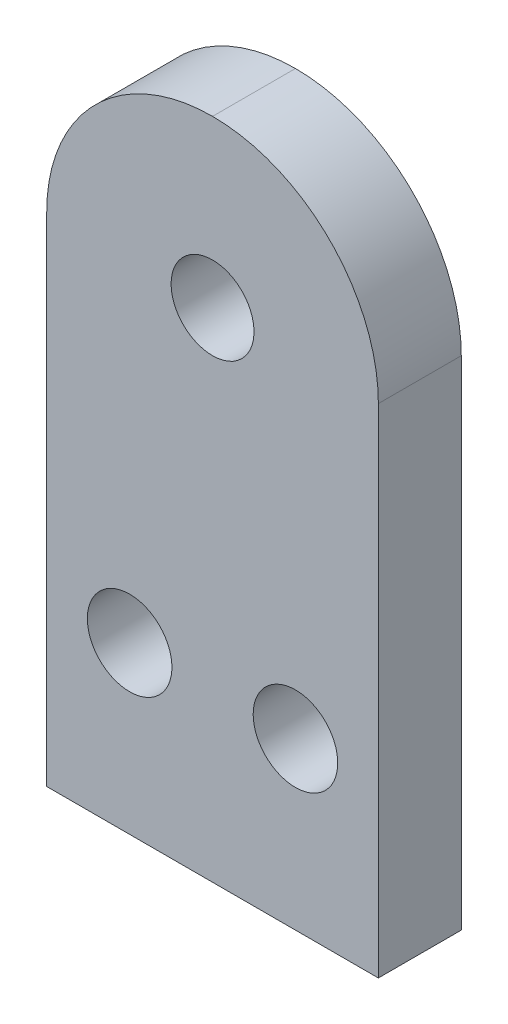
ISO-10303-21;
HEADER;
FILE_DESCRIPTION(('STEP AP214'),'2;1');
FILE_NAME('part.step','',(''),(''),'','','');
FILE_SCHEMA(('AUTOMOTIVE_DESIGN { 1 0 10303 214 1 1 1 1 }'));
ENDSEC;
DATA;
#1=APPLICATION_CONTEXT('core data for automotive mechanical design processes');
#2=APPLICATION_PROTOCOL_DEFINITION('international standard','automotive_design',2000,#1);
#3=PRODUCT_CONTEXT('',#1,'mechanical');
#4=PRODUCT('Part','Part','',(#3));
#5=PRODUCT_RELATED_PRODUCT_CATEGORY('part','',(#4));
#6=PRODUCT_DEFINITION_FORMATION('','',#4);
#7=PRODUCT_DEFINITION_CONTEXT('part definition',#1,'design');
#8=PRODUCT_DEFINITION('design','',#6,#7);
#9=PRODUCT_DEFINITION_SHAPE('','',#8);
#10=(LENGTH_UNIT() NAMED_UNIT(*) SI_UNIT(.MILLI.,.METRE.));
#11=(NAMED_UNIT(*) PLANE_ANGLE_UNIT() SI_UNIT($,.RADIAN.));
#12=(NAMED_UNIT(*) SI_UNIT($,.STERADIAN.) SOLID_ANGLE_UNIT());
#13=UNCERTAINTY_MEASURE_WITH_UNIT(LENGTH_MEASURE(1.E-05),#10,'distance_accuracy_value','');
#14=(GEOMETRIC_REPRESENTATION_CONTEXT(3) GLOBAL_UNCERTAINTY_ASSIGNED_CONTEXT((#13)) GLOBAL_UNIT_ASSIGNED_CONTEXT((#10,
#11,#12)) REPRESENTATION_CONTEXT('',''));
#15=CARTESIAN_POINT('',(0.,0.,0.));
#16=DIRECTION('',(0.,0.,1.));
#17=DIRECTION('',(1.,0.,0.));
#18=AXIS2_PLACEMENT_3D('',#15,#16,#17);
#19=CARTESIAN_POINT('',(-10.,-20.,5.));
#20=DIRECTION('',(1.,0.,0.));
#21=DIRECTION('',(0.,0.,-1.));
#22=AXIS2_PLACEMENT_3D('',#19,#20,#21);
#23=PLANE('',#22);
#24=DIRECTION('',(0.,-1.,0.));
#25=VECTOR('',#24,1.);
#26=CARTESIAN_POINT('',(-10.,-20.,5.));
#27=LINE('',#26,#25);
#28=CARTESIAN_POINT('',(-10.,10.,5.));
#29=VERTEX_POINT('',#28);
#30=CARTESIAN_POINT('',(-10.,-20.,5.));
#31=VERTEX_POINT('',#30);
#32=EDGE_CURVE('E79',#29,#31,#27,.T.);
#33=ORIENTED_EDGE('',*,*,#32,.F.);
#34=DIRECTION('',(0.,0.,-1.));
#35=VECTOR('',#34,1.);
#36=CARTESIAN_POINT('',(-10.,10.,5.));
#37=LINE('',#36,#35);
#38=CARTESIAN_POINT('',(-10.,10.,0.));
#39=VERTEX_POINT('',#38);
#40=EDGE_CURVE('E102',#29,#39,#37,.T.);
#41=ORIENTED_EDGE('',*,*,#40,.T.);
#42=DIRECTION('',(0.,-1.,0.));
#43=VECTOR('',#42,1.);
#44=CARTESIAN_POINT('',(-10.,-20.,0.));
#45=LINE('',#44,#43);
#46=CARTESIAN_POINT('',(-10.,-20.,0.));
#47=VERTEX_POINT('',#46);
#48=EDGE_CURVE('E100',#39,#47,#45,.T.);
#49=ORIENTED_EDGE('',*,*,#48,.T.);
#50=DIRECTION('',(0.,0.,-1.));
#51=VECTOR('',#50,1.);
#52=CARTESIAN_POINT('',(-10.,-20.,5.));
#53=LINE('',#52,#51);
#54=EDGE_CURVE('E94',#31,#47,#53,.T.);
#55=ORIENTED_EDGE('',*,*,#54,.F.);
#56=EDGE_LOOP('',(#33,#41,#49,#55));
#57=FACE_BOUND('',#56,.T.);
#58=ADVANCED_FACE('F33',(#57),#23,.F.);
#59=CARTESIAN_POINT('',(10.,-20.,5.));
#60=DIRECTION('',(0.,1.,0.));
#61=DIRECTION('',(0.,0.,1.));
#62=AXIS2_PLACEMENT_3D('',#59,#60,#61);
#63=PLANE('',#62);
#64=DIRECTION('',(1.,0.,0.));
#65=VECTOR('',#64,1.);
#66=CARTESIAN_POINT('',(10.,-20.,0.));
#67=LINE('',#66,#65);
#68=CARTESIAN_POINT('',(10.,-20.,0.));
#69=VERTEX_POINT('',#68);
#70=EDGE_CURVE('E122',#47,#69,#67,.T.);
#71=ORIENTED_EDGE('',*,*,#70,.T.);
#72=DIRECTION('',(0.,0.,-1.));
#73=VECTOR('',#72,1.);
#74=CARTESIAN_POINT('',(10.,-20.,5.));
#75=LINE('',#74,#73);
#76=CARTESIAN_POINT('',(10.,-20.,5.));
#77=VERTEX_POINT('',#76);
#78=EDGE_CURVE('E96',#77,#69,#75,.T.);
#79=ORIENTED_EDGE('',*,*,#78,.F.);
#80=DIRECTION('',(1.,0.,0.));
#81=VECTOR('',#80,1.);
#82=CARTESIAN_POINT('',(10.,-20.,5.));
#83=LINE('',#82,#81);
#84=EDGE_CURVE('E82',#31,#77,#83,.T.);
#85=ORIENTED_EDGE('',*,*,#84,.F.);
#86=ORIENTED_EDGE('',*,*,#54,.T.);
#87=EDGE_LOOP('',(#71,#79,#85,#86));
#88=FACE_BOUND('',#87,.T.);
#89=ADVANCED_FACE('F93',(#88),#63,.F.);
#90=CARTESIAN_POINT('',(10.,-20.,5.));
#91=DIRECTION('',(-1.,0.,0.));
#92=DIRECTION('',(0.,0.,1.));
#93=AXIS2_PLACEMENT_3D('',#90,#91,#92);
#94=PLANE('',#93);
#95=DIRECTION('',(0.,1.,0.));
#96=VECTOR('',#95,1.);
#97=CARTESIAN_POINT('',(10.,-20.,0.));
#98=LINE('',#97,#96);
#99=CARTESIAN_POINT('',(10.,10.,0.));
#100=VERTEX_POINT('',#99);
#101=EDGE_CURVE('E89',#69,#100,#98,.T.);
#102=ORIENTED_EDGE('',*,*,#101,.T.);
#103=DIRECTION('',(0.,0.,-1.));
#104=VECTOR('',#103,1.);
#105=CARTESIAN_POINT('',(10.,10.,5.));
#106=LINE('',#105,#104);
#107=CARTESIAN_POINT('',(10.,10.,5.));
#108=VERTEX_POINT('',#107);
#109=EDGE_CURVE('E11',#100,#108,#106,.F.);
#110=ORIENTED_EDGE('',*,*,#109,.T.);
#111=DIRECTION('',(0.,1.,0.));
#112=VECTOR('',#111,1.);
#113=CARTESIAN_POINT('',(10.,-20.,5.));
#114=LINE('',#113,#112);
#115=EDGE_CURVE('E97',#77,#108,#114,.T.);
#116=ORIENTED_EDGE('',*,*,#115,.F.);
#117=ORIENTED_EDGE('',*,*,#78,.T.);
#118=EDGE_LOOP('',(#102,#110,#116,#117));
#119=FACE_BOUND('',#118,.T.);
#120=ADVANCED_FACE('F137',(#119),#94,.F.);
#121=CARTESIAN_POINT('',(0.,0.,5.));
#122=DIRECTION('',(0.,0.,1.));
#123=DIRECTION('',(1.,0.,0.));
#124=AXIS2_PLACEMENT_3D('',#121,#122,#123);
#125=PLANE('',#124);
#126=CARTESIAN_POINT('',(-5.,-9.99999999999999,5.));
#127=DIRECTION('',(0.,0.,-1.));
#128=DIRECTION('',(-1.,0.,0.));
#129=AXIS2_PLACEMENT_3D('',#126,#127,#128);
#130=CIRCLE('',#129,2.55);
#131=CARTESIAN_POINT('',(-7.55,-9.99999999999999,5.));
#132=VERTEX_POINT('',#131);
#133=EDGE_CURVE('E181',#132,#132,#130,.T.);
#134=ORIENTED_EDGE('',*,*,#133,.T.);
#135=EDGE_LOOP('',(#134));
#136=FACE_BOUND('',#135,.T.);
#137=CARTESIAN_POINT('',(5.,-9.99999999999999,5.));
#138=DIRECTION('',(0.,0.,-1.));
#139=DIRECTION('',(-1.,0.,0.));
#140=AXIS2_PLACEMENT_3D('',#137,#138,#139);
#141=CIRCLE('',#140,2.55);
#142=CARTESIAN_POINT('',(2.45,-9.99999999999999,5.));
#143=VERTEX_POINT('',#142);
#144=EDGE_CURVE('E130',#143,#143,#141,.T.);
#145=ORIENTED_EDGE('',*,*,#144,.T.);
#146=EDGE_LOOP('',(#145));
#147=FACE_BOUND('',#146,.T.);
#148=CARTESIAN_POINT('',(0.,10.,5.));
#149=DIRECTION('',(0.,0.,-1.));
#150=DIRECTION('',(-1.,0.,0.));
#151=AXIS2_PLACEMENT_3D('',#148,#149,#150);
#152=CIRCLE('',#151,2.5);
#153=CARTESIAN_POINT('',(-2.5,10.,5.));
#154=VERTEX_POINT('',#153);
#155=EDGE_CURVE('E121',#154,#154,#152,.T.);
#156=ORIENTED_EDGE('',*,*,#155,.T.);
#157=EDGE_LOOP('',(#156));
#158=FACE_BOUND('',#157,.T.);
#159=CARTESIAN_POINT('',(0.,10.,5.));
#160=DIRECTION('',(0.,0.,1.));
#161=DIRECTION('',(1.,0.,0.));
#162=AXIS2_PLACEMENT_3D('',#159,#160,#161);
#163=CIRCLE('',#162,10.);
#164=CARTESIAN_POINT('',(0.,20.,5.));
#165=VERTEX_POINT('',#164);
#166=EDGE_CURVE('E49',#108,#165,#163,.T.);
#167=ORIENTED_EDGE('',*,*,#166,.T.);
#168=CARTESIAN_POINT('',(0.,10.,5.));
#169=DIRECTION('',(0.,0.,1.));
#170=DIRECTION('',(1.,0.,0.));
#171=AXIS2_PLACEMENT_3D('',#168,#169,#170);
#172=CIRCLE('',#171,10.);
#173=EDGE_CURVE('E42',#165,#29,#172,.T.);
#174=ORIENTED_EDGE('',*,*,#173,.T.);
#175=ORIENTED_EDGE('',*,*,#32,.T.);
#176=ORIENTED_EDGE('',*,*,#84,.T.);
#177=ORIENTED_EDGE('',*,*,#115,.T.);
#178=EDGE_LOOP('',(#167,#174,#175,#176,#177));
#179=FACE_BOUND('',#178,.T.);
#180=ADVANCED_FACE('F81',(#136,#147,#158,#179),#125,.T.);
#181=CARTESIAN_POINT('',(0.,0.,0.));
#182=DIRECTION('',(0.,0.,1.));
#183=DIRECTION('',(1.,0.,0.));
#184=AXIS2_PLACEMENT_3D('',#181,#182,#183);
#185=PLANE('',#184);
#186=CARTESIAN_POINT('',(-5.,-9.99999999999999,0.));
#187=DIRECTION('',(0.,0.,-1.));
#188=DIRECTION('',(-1.,0.,0.));
#189=AXIS2_PLACEMENT_3D('',#186,#187,#188);
#190=CIRCLE('',#189,2.55);
#191=CARTESIAN_POINT('',(-7.55,-9.99999999999999,0.));
#192=VERTEX_POINT('',#191);
#193=EDGE_CURVE('E183',#192,#192,#190,.T.);
#194=ORIENTED_EDGE('',*,*,#193,.F.);
#195=EDGE_LOOP('',(#194));
#196=FACE_BOUND('',#195,.T.);
#197=CARTESIAN_POINT('',(5.,-9.99999999999999,0.));
#198=DIRECTION('',(0.,0.,-1.));
#199=DIRECTION('',(-1.,0.,0.));
#200=AXIS2_PLACEMENT_3D('',#197,#198,#199);
#201=CIRCLE('',#200,2.55);
#202=CARTESIAN_POINT('',(2.45,-9.99999999999999,0.));
#203=VERTEX_POINT('',#202);
#204=EDGE_CURVE('E133',#203,#203,#201,.T.);
#205=ORIENTED_EDGE('',*,*,#204,.F.);
#206=EDGE_LOOP('',(#205));
#207=FACE_BOUND('',#206,.T.);
#208=CARTESIAN_POINT('',(0.,10.,0.));
#209=DIRECTION('',(0.,0.,-1.));
#210=DIRECTION('',(-1.,0.,0.));
#211=AXIS2_PLACEMENT_3D('',#208,#209,#210);
#212=CIRCLE('',#211,2.5);
#213=CARTESIAN_POINT('',(-2.5,10.,0.));
#214=VERTEX_POINT('',#213);
#215=EDGE_CURVE('E125',#214,#214,#212,.T.);
#216=ORIENTED_EDGE('',*,*,#215,.F.);
#217=EDGE_LOOP('',(#216));
#218=FACE_BOUND('',#217,.T.);
#219=ORIENTED_EDGE('',*,*,#48,.F.);
#220=CARTESIAN_POINT('',(0.,10.,0.));
#221=DIRECTION('',(0.,0.,1.));
#222=DIRECTION('',(1.,0.,0.));
#223=AXIS2_PLACEMENT_3D('',#220,#221,#222);
#224=CIRCLE('',#223,10.);
#225=CARTESIAN_POINT('',(0.,20.,0.));
#226=VERTEX_POINT('',#225);
#227=EDGE_CURVE('E110',#39,#226,#224,.F.);
#228=ORIENTED_EDGE('',*,*,#227,.T.);
#229=CARTESIAN_POINT('',(0.,10.,0.));
#230=DIRECTION('',(0.,0.,1.));
#231=DIRECTION('',(1.,0.,0.));
#232=AXIS2_PLACEMENT_3D('',#229,#230,#231);
#233=CIRCLE('',#232,10.);
#234=EDGE_CURVE('E104',#226,#100,#233,.F.);
#235=ORIENTED_EDGE('',*,*,#234,.T.);
#236=ORIENTED_EDGE('',*,*,#101,.F.);
#237=ORIENTED_EDGE('',*,*,#70,.F.);
#238=EDGE_LOOP('',(#219,#228,#235,#236,#237));
#239=FACE_BOUND('',#238,.T.);
#240=ADVANCED_FACE('F115',(#196,#207,#218,#239),#185,.F.);
#241=CARTESIAN_POINT('',(0.,10.,5.));
#242=DIRECTION('',(0.,0.,-1.));
#243=DIRECTION('',(-1.,0.,0.));
#244=AXIS2_PLACEMENT_3D('',#241,#242,#243);
#245=CYLINDRICAL_SURFACE('',#244,10.);
#246=DIRECTION('',(0.,0.,-1.));
#247=VECTOR('',#246,1.);
#248=CARTESIAN_POINT('',(0.,20.,5.));
#249=LINE('',#248,#247);
#250=EDGE_CURVE('E37',#165,#226,#249,.T.);
#251=ORIENTED_EDGE('',*,*,#250,.F.);
#252=ORIENTED_EDGE('',*,*,#166,.F.);
#253=ORIENTED_EDGE('',*,*,#109,.F.);
#254=ORIENTED_EDGE('',*,*,#234,.F.);
#255=EDGE_LOOP('',(#251,#252,#253,#254));
#256=FACE_BOUND('',#255,.T.);
#257=ADVANCED_FACE('F35',(#256),#245,.T.);
#258=CARTESIAN_POINT('',(0.,10.,5.));
#259=DIRECTION('',(0.,0.,-1.));
#260=DIRECTION('',(-1.,0.,0.));
#261=AXIS2_PLACEMENT_3D('',#258,#259,#260);
#262=CYLINDRICAL_SURFACE('',#261,10.);
#263=ORIENTED_EDGE('',*,*,#173,.F.);
#264=ORIENTED_EDGE('',*,*,#250,.T.);
#265=ORIENTED_EDGE('',*,*,#227,.F.);
#266=ORIENTED_EDGE('',*,*,#40,.F.);
#267=EDGE_LOOP('',(#263,#264,#265,#266));
#268=FACE_BOUND('',#267,.T.);
#269=ADVANCED_FACE('F120',(#268),#262,.T.);
#270=CARTESIAN_POINT('',(0.,10.,5.));
#271=DIRECTION('',(0.,0.,-1.));
#272=DIRECTION('',(-1.,0.,0.));
#273=AXIS2_PLACEMENT_3D('',#270,#271,#272);
#274=CYLINDRICAL_SURFACE('',#273,2.5);
#275=ORIENTED_EDGE('',*,*,#155,.F.);
#276=EDGE_LOOP('',(#275));
#277=FACE_BOUND('',#276,.T.);
#278=ORIENTED_EDGE('',*,*,#215,.T.);
#279=EDGE_LOOP('',(#278));
#280=FACE_BOUND('',#279,.T.);
#281=ADVANCED_FACE('F153',(#277,#280),#274,.F.);
#282=CARTESIAN_POINT('',(5.,-9.99999999999999,5.));
#283=DIRECTION('',(0.,0.,-1.));
#284=DIRECTION('',(-1.,0.,0.));
#285=AXIS2_PLACEMENT_3D('',#282,#283,#284);
#286=CYLINDRICAL_SURFACE('',#285,2.55);
#287=ORIENTED_EDGE('',*,*,#144,.F.);
#288=EDGE_LOOP('',(#287));
#289=FACE_BOUND('',#288,.T.);
#290=ORIENTED_EDGE('',*,*,#204,.T.);
#291=EDGE_LOOP('',(#290));
#292=FACE_BOUND('',#291,.T.);
#293=ADVANCED_FACE('F158',(#289,#292),#286,.F.);
#294=CARTESIAN_POINT('',(-5.,-9.99999999999999,5.));
#295=DIRECTION('',(0.,0.,-1.));
#296=DIRECTION('',(-1.,0.,0.));
#297=AXIS2_PLACEMENT_3D('',#294,#295,#296);
#298=CYLINDRICAL_SURFACE('',#297,2.55);
#299=ORIENTED_EDGE('',*,*,#133,.F.);
#300=EDGE_LOOP('',(#299));
#301=FACE_BOUND('',#300,.T.);
#302=ORIENTED_EDGE('',*,*,#193,.T.);
#303=EDGE_LOOP('',(#302));
#304=FACE_BOUND('',#303,.T.);
#305=ADVANCED_FACE('F172',(#301,#304),#298,.F.);
#306=CLOSED_SHELL('',(#58,#89,#120,#180,#240,#257,#269,#281,#293,#305));
#307=MANIFOLD_SOLID_BREP('B2',#306);
#308=ADVANCED_BREP_SHAPE_REPRESENTATION('',(#18,#307),#14);
#309=SHAPE_DEFINITION_REPRESENTATION(#9,#308);
ENDSEC;
END-ISO-10303-21;
